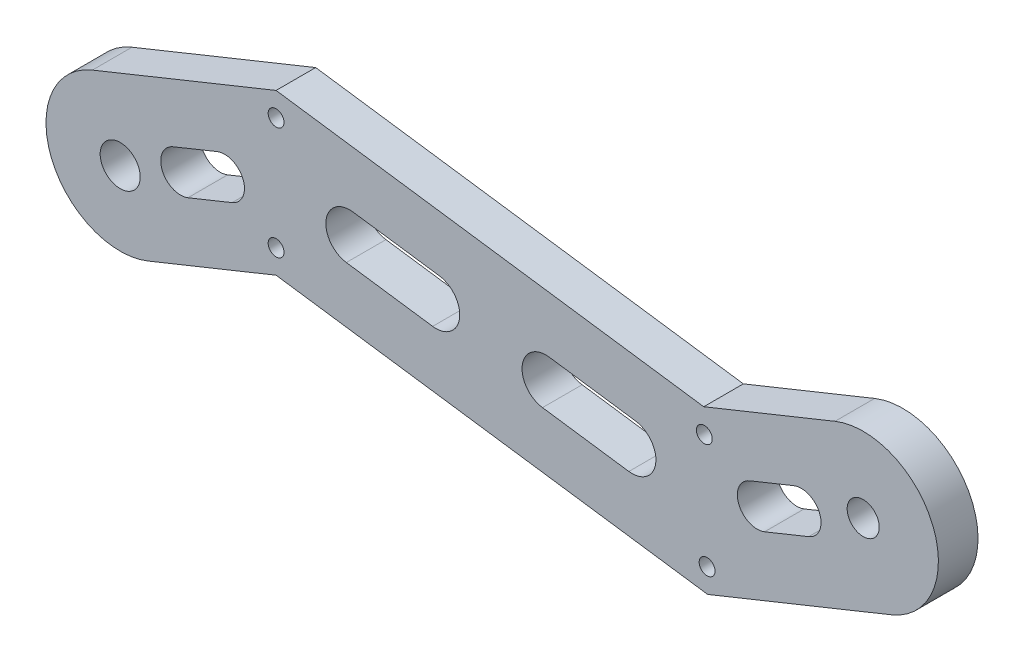
ISO-10303-21;
HEADER;
FILE_DESCRIPTION(('STEP AP214'),'2;1');
FILE_NAME('part.step','',(''),(''),'','','');
FILE_SCHEMA(('AUTOMOTIVE_DESIGN { 1 0 10303 214 1 1 1 1 }'));
ENDSEC;
DATA;
#1=APPLICATION_CONTEXT('core data for automotive mechanical design processes');
#2=APPLICATION_PROTOCOL_DEFINITION('international standard','automotive_design',2000,#1);
#3=PRODUCT_CONTEXT('',#1,'mechanical');
#4=PRODUCT('Part','Part','',(#3));
#5=PRODUCT_RELATED_PRODUCT_CATEGORY('part','',(#4));
#6=PRODUCT_DEFINITION_FORMATION('','',#4);
#7=PRODUCT_DEFINITION_CONTEXT('part definition',#1,'design');
#8=PRODUCT_DEFINITION('design','',#6,#7);
#9=PRODUCT_DEFINITION_SHAPE('','',#8);
#10=(LENGTH_UNIT() NAMED_UNIT(*) SI_UNIT(.MILLI.,.METRE.));
#11=(NAMED_UNIT(*) PLANE_ANGLE_UNIT() SI_UNIT($,.RADIAN.));
#12=(NAMED_UNIT(*) SI_UNIT($,.STERADIAN.) SOLID_ANGLE_UNIT());
#13=UNCERTAINTY_MEASURE_WITH_UNIT(LENGTH_MEASURE(1.E-05),#10,'distance_accuracy_value','');
#14=(GEOMETRIC_REPRESENTATION_CONTEXT(3) GLOBAL_UNCERTAINTY_ASSIGNED_CONTEXT((#13)) GLOBAL_UNIT_ASSIGNED_CONTEXT((#10,
#11,#12)) REPRESENTATION_CONTEXT('',''));
#15=CARTESIAN_POINT('',(0.,0.,0.));
#16=DIRECTION('',(0.,0.,1.));
#17=DIRECTION('',(1.,0.,0.));
#18=AXIS2_PLACEMENT_3D('',#15,#16,#17);
#19=CARTESIAN_POINT('',(-91.8699436205663,2.980916678925,10.));
#20=DIRECTION('',(0.,0.,1.));
#21=DIRECTION('',(1.,0.,0.));
#22=AXIS2_PLACEMENT_3D('',#19,#20,#21);
#23=PLANE('',#22);
#24=DIRECTION('',(0.927183854566787,0.374606593415913,0.));
#25=VECTOR('',#24,1.);
#26=CARTESIAN_POINT('',(70.7597122956534,4.2465525505887,10.));
#27=LINE('',#26,#25);
#28=CARTESIAN_POINT('',(70.7597122956534,4.2465525505887,10.));
#29=VERTEX_POINT('',#28);
#30=CARTESIAN_POINT('',(81.8859185504549,8.74183167157967,10.));
#31=VERTEX_POINT('',#30);
#32=EDGE_CURVE('E269',#29,#31,#27,.T.);
#33=ORIENTED_EDGE('',*,*,#32,.F.);
#34=CARTESIAN_POINT('',(68.8866793285738,8.88247182342264,10.));
#35=DIRECTION('',(0.,0.,1.));
#36=DIRECTION('',(1.,0.,0.));
#37=AXIS2_PLACEMENT_3D('',#34,#35,#36);
#38=CIRCLE('',#37,5.);
#39=CARTESIAN_POINT('',(67.0136463614943,13.5183910962566,10.));
#40=VERTEX_POINT('',#39);
#41=EDGE_CURVE('E267',#40,#29,#38,.T.);
#42=ORIENTED_EDGE('',*,*,#41,.F.);
#43=DIRECTION('',(-0.927183854566787,-0.374606593415913,0.));
#44=VECTOR('',#43,1.);
#45=CARTESIAN_POINT('',(67.0136463614943,13.5183910962566,10.));
#46=LINE('',#45,#44);
#47=CARTESIAN_POINT('',(78.1398526162957,18.0136702172475,10.));
#48=VERTEX_POINT('',#47);
#49=EDGE_CURVE('E275',#48,#40,#46,.T.);
#50=ORIENTED_EDGE('',*,*,#49,.F.);
#51=CARTESIAN_POINT('',(80.0128855833753,13.3777509444136,10.));
#52=DIRECTION('',(0.,0.,1.));
#53=DIRECTION('',(1.,0.,0.));
#54=AXIS2_PLACEMENT_3D('',#51,#52,#53);
#55=CIRCLE('',#54,5.);
#56=EDGE_CURVE('E272',#31,#48,#55,.T.);
#57=ORIENTED_EDGE('',*,*,#56,.F.);
#58=EDGE_LOOP('',(#33,#42,#50,#57));
#59=FACE_BOUND('',#58,.T.);
#60=DIRECTION('',(0.927183854566787,0.374606593415913,0.));
#61=VECTOR('',#60,1.);
#62=CARTESIAN_POINT('',(-74.7593499035873,4.50137156680685,10.));
#63=LINE('',#62,#61);
#64=CARTESIAN_POINT('',(-74.7593499035873,4.50137156680685,10.));
#65=VERTEX_POINT('',#64);
#66=CARTESIAN_POINT('',(-63.6331436487858,8.99665068779783,10.));
#67=VERTEX_POINT('',#66);
#68=EDGE_CURVE('E300',#65,#67,#63,.T.);
#69=ORIENTED_EDGE('',*,*,#68,.F.);
#70=CARTESIAN_POINT('',(-76.6323828706669,9.1372908396408,10.));
#71=DIRECTION('',(0.,0.,1.));
#72=DIRECTION('',(1.,0.,0.));
#73=AXIS2_PLACEMENT_3D('',#70,#71,#72);
#74=CIRCLE('',#73,5.);
#75=CARTESIAN_POINT('',(-78.5054158377464,13.7732101124747,10.));
#76=VERTEX_POINT('',#75);
#77=EDGE_CURVE('E298',#76,#65,#74,.T.);
#78=ORIENTED_EDGE('',*,*,#77,.F.);
#79=DIRECTION('',(-0.927183854566787,-0.374606593415913,0.));
#80=VECTOR('',#79,1.);
#81=CARTESIAN_POINT('',(-78.5054158377464,13.7732101124747,10.));
#82=LINE('',#81,#80);
#83=CARTESIAN_POINT('',(-67.379209582945,18.2684892334657,10.));
#84=VERTEX_POINT('',#83);
#85=EDGE_CURVE('E306',#84,#76,#82,.T.);
#86=ORIENTED_EDGE('',*,*,#85,.F.);
#87=CARTESIAN_POINT('',(-65.5061766158654,13.6325699606318,10.));
#88=DIRECTION('',(0.,0.,1.));
#89=DIRECTION('',(1.,0.,0.));
#90=AXIS2_PLACEMENT_3D('',#87,#88,#89);
#91=CIRCLE('',#90,5.);
#92=EDGE_CURVE('E303',#67,#84,#91,.T.);
#93=ORIENTED_EDGE('',*,*,#92,.F.);
#94=EDGE_LOOP('',(#69,#78,#86,#93));
#95=FACE_BOUND('',#94,.T.);
#96=CARTESIAN_POINT('',(-52.5256026519304,4.68051081808217,10.));
#97=DIRECTION('',(0.,0.,1.));
#98=DIRECTION('',(1.,0.,0.));
#99=AXIS2_PLACEMENT_3D('',#96,#97,#98);
#100=CIRCLE('',#99,2.);
#101=CARTESIAN_POINT('',(-50.5256026519304,4.68051081808217,10.));
#102=VERTEX_POINT('',#101);
#103=EDGE_CURVE('E329',#102,#102,#100,.T.);
#104=ORIENTED_EDGE('',*,*,#103,.F.);
#105=EDGE_LOOP('',(#104));
#106=FACE_BOUND('',#105,.T.);
#107=CARTESIAN_POINT('',(-52.5256026519304,33.0736137188269,10.));
#108=DIRECTION('',(0.,0.,1.));
#109=DIRECTION('',(1.,0.,0.));
#110=AXIS2_PLACEMENT_3D('',#107,#108,#109);
#111=CIRCLE('',#110,2.);
#112=CARTESIAN_POINT('',(-50.5256026519304,33.0736137188269,10.));
#113=VERTEX_POINT('',#112);
#114=EDGE_CURVE('E341',#113,#113,#111,.T.);
#115=ORIENTED_EDGE('',*,*,#114,.F.);
#116=EDGE_LOOP('',(#115));
#117=FACE_BOUND('',#116,.T.);
#118=CARTESIAN_POINT('',(-91.8699436205663,2.980916678925,10.));
#119=DIRECTION('',(0.,0.,1.));
#120=DIRECTION('',(1.,0.,0.));
#121=AXIS2_PLACEMENT_3D('',#118,#119,#120);
#122=CIRCLE('',#121,5.05);
#123=CARTESIAN_POINT('',(-86.8199436205663,2.980916678925,10.));
#124=VERTEX_POINT('',#123);
#125=EDGE_CURVE('E353',#124,#124,#122,.T.);
#126=ORIENTED_EDGE('',*,*,#125,.F.);
#127=EDGE_LOOP('',(#126));
#128=FACE_BOUND('',#127,.T.);
#129=DIRECTION('',(-0.927183854566787,-0.374606593415913,0.));
#130=VECTOR('',#129,1.);
#131=CARTESIAN_POINT('',(-52.5256026519304,39.0736137188269,10.));
#132=LINE('',#131,#130);
#133=CARTESIAN_POINT('',(-52.5256026519304,39.0736137188269,10.));
#134=VERTEX_POINT('',#133);
#135=CARTESIAN_POINT('',(-98.8847953802698,20.3432840480312,10.));
#136=VERTEX_POINT('',#135);
#137=EDGE_CURVE('E359',#134,#136,#132,.T.);
#138=ORIENTED_EDGE('',*,*,#137,.T.);
#139=CARTESIAN_POINT('',(-91.8699436205663,2.980916678925,10.));
#140=DIRECTION('',(0.,0.,1.));
#141=DIRECTION('',(1.,0.,0.));
#142=AXIS2_PLACEMENT_3D('',#139,#140,#141);
#143=CIRCLE('',#142,18.7259164227127);
#144=CARTESIAN_POINT('',(-84.8550918608627,-14.3814506901812,10.));
#145=VERTEX_POINT('',#144);
#146=EDGE_CURVE('E362',#136,#145,#143,.T.);
#147=ORIENTED_EDGE('',*,*,#146,.T.);
#148=DIRECTION('',(0.927183854566787,0.374606593415913,0.));
#149=VECTOR('',#148,1.);
#150=CARTESIAN_POINT('',(-52.5256026519304,-1.31948918191783,10.));
#151=LINE('',#150,#149);
#152=CARTESIAN_POINT('',(-52.5256026519304,-1.31948918191783,10.));
#153=VERTEX_POINT('',#152);
#154=EDGE_CURVE('E365',#145,#153,#151,.T.);
#155=ORIENTED_EDGE('',*,*,#154,.T.);
#156=DIRECTION('',(0.99026806874157,-0.139173100960066,0.));
#157=VECTOR('',#156,1.);
#158=CARTESIAN_POINT('',(-52.5256026519304,-1.31948918191783,10.));
#159=LINE('',#158,#157);
#160=CARTESIAN_POINT('',(56.4038849096423,-16.6285302875251,10.));
#161=VERTEX_POINT('',#160);
#162=EDGE_CURVE('E367',#153,#161,#159,.T.);
#163=ORIENTED_EDGE('',*,*,#162,.T.);
#164=DIRECTION('',(0.927183854566787,0.374606593415913,0.));
#165=VECTOR('',#164,1.);
#166=CARTESIAN_POINT('',(56.4038849096423,-16.6285302875251,10.));
#167=LINE('',#166,#165);
#168=CARTESIAN_POINT('',(102.763077637982,2.10179938327057,10.));
#169=VERTEX_POINT('',#168);
#170=EDGE_CURVE('E369',#161,#169,#167,.T.);
#171=ORIENTED_EDGE('',*,*,#170,.T.);
#172=CARTESIAN_POINT('',(95.6540738473726,19.6972012062936,10.));
#173=DIRECTION('',(0.,0.,1.));
#174=DIRECTION('',(-1.,0.,0.));
#175=AXIS2_PLACEMENT_3D('',#172,#173,#174);
#176=CIRCLE('',#175,18.9772521775028);
#177=CARTESIAN_POINT('',(88.5450700567636,37.2926030293166,10.));
#178=VERTEX_POINT('',#177);
#179=EDGE_CURVE('E371',#169,#178,#176,.T.);
#180=ORIENTED_EDGE('',*,*,#179,.T.);
#181=DIRECTION('',(-0.927183854566787,-0.374606593415913,0.));
#182=VECTOR('',#181,1.);
#183=CARTESIAN_POINT('',(55.4083258196354,23.9044893187248,10.));
#184=LINE('',#183,#182);
#185=CARTESIAN_POINT('',(55.4083258196354,23.9044893187248,10.));
#186=VERTEX_POINT('',#185);
#187=EDGE_CURVE('E373',#178,#186,#184,.T.);
#188=ORIENTED_EDGE('',*,*,#187,.T.);
#189=DIRECTION('',(-0.99026806874157,0.139173100960066,0.));
#190=VECTOR('',#189,1.);
#191=CARTESIAN_POINT('',(-52.5256026519304,39.0736137188269,10.));
#192=LINE('',#191,#190);
#193=EDGE_CURVE('E375',#186,#134,#192,.T.);
#194=ORIENTED_EDGE('',*,*,#193,.T.);
#195=EDGE_LOOP('',(#138,#147,#155,#163,#171,#180,#188,#194));
#196=FACE_BOUND('',#195,.T.);
#197=CARTESIAN_POINT('',(95.6540738473726,19.6972012062936,10.));
#198=DIRECTION('',(0.,0.,1.));
#199=DIRECTION('',(1.,0.,0.));
#200=AXIS2_PLACEMENT_3D('',#197,#198,#199);
#201=CIRCLE('',#200,4.05);
#202=CARTESIAN_POINT('',(99.7040738473727,19.6972012062936,10.));
#203=VERTEX_POINT('',#202);
#204=EDGE_CURVE('E347',#203,#203,#201,.T.);
#205=ORIENTED_EDGE('',*,*,#204,.F.);
#206=EDGE_LOOP('',(#205));
#207=FACE_BOUND('',#206,.T.);
#208=CARTESIAN_POINT('',(55.555695904521,17.9044893187248,10.));
#209=DIRECTION('',(0.,0.,1.));
#210=DIRECTION('',(1.,0.,0.));
#211=AXIS2_PLACEMENT_3D('',#208,#209,#210);
#212=CIRCLE('',#211,2.);
#213=CARTESIAN_POINT('',(57.555695904521,17.9044893187248,10.));
#214=VERTEX_POINT('',#213);
#215=EDGE_CURVE('E335',#214,#214,#212,.T.);
#216=ORIENTED_EDGE('',*,*,#215,.F.);
#217=EDGE_LOOP('',(#216));
#218=FACE_BOUND('',#217,.T.);
#219=CARTESIAN_POINT('',(56.2565148247568,-10.6285302875251,10.));
#220=DIRECTION('',(0.,0.,1.));
#221=DIRECTION('',(1.,0.,0.));
#222=AXIS2_PLACEMENT_3D('',#219,#220,#221);
#223=CIRCLE('',#222,2.);
#224=CARTESIAN_POINT('',(58.2565148247568,-10.6285302875251,10.));
#225=VERTEX_POINT('',#224);
#226=EDGE_CURVE('E261',#225,#225,#223,.T.);
#227=ORIENTED_EDGE('',*,*,#226,.F.);
#228=EDGE_LOOP('',(#227));
#229=FACE_BOUND('',#228,.T.);
#230=DIRECTION('',(0.99026806874157,-0.139173100960066,0.));
#231=VECTOR('',#230,1.);
#232=CARTESIAN_POINT('',(-34.7944377241027,10.3261441141401,10.));
#233=LINE('',#232,#231);
#234=CARTESIAN_POINT('',(-34.7944377241027,10.3261441141401,10.));
#235=VERTEX_POINT('',#234);
#236=CARTESIAN_POINT('',(-13.0085402117882,7.2643358930187,10.));
#237=VERTEX_POINT('',#236);
#238=EDGE_CURVE('E232',#235,#237,#233,.T.);
#239=ORIENTED_EDGE('',*,*,#238,.F.);
#240=CARTESIAN_POINT('',(-33.9593991183423,16.2677525265896,10.));
#241=DIRECTION('',(0.,0.,1.));
#242=DIRECTION('',(1.,0.,0.));
#243=AXIS2_PLACEMENT_3D('',#240,#241,#242);
#244=CIRCLE('',#243,6.);
#245=CARTESIAN_POINT('',(-33.1243605125819,22.209360939039,10.));
#246=VERTEX_POINT('',#245);
#247=EDGE_CURVE('E230',#246,#235,#244,.T.);
#248=ORIENTED_EDGE('',*,*,#247,.F.);
#249=DIRECTION('',(-0.99026806874157,0.139173100960065,0.));
#250=VECTOR('',#249,1.);
#251=CARTESIAN_POINT('',(-33.1243605125819,22.209360939039,10.));
#252=LINE('',#251,#250);
#253=CARTESIAN_POINT('',(-11.3384630002674,19.1475527179175,10.));
#254=VERTEX_POINT('',#253);
#255=EDGE_CURVE('E238',#254,#246,#252,.T.);
#256=ORIENTED_EDGE('',*,*,#255,.F.);
#257=CARTESIAN_POINT('',(-12.1735016060278,13.2059443054681,10.));
#258=DIRECTION('',(0.,0.,1.));
#259=DIRECTION('',(1.,0.,0.));
#260=AXIS2_PLACEMENT_3D('',#257,#258,#259);
#261=CIRCLE('',#260,6.);
#262=EDGE_CURVE('E235',#237,#254,#261,.T.);
#263=ORIENTED_EDGE('',*,*,#262,.F.);
#264=EDGE_LOOP('',(#239,#248,#256,#263));
#265=FACE_BOUND('',#264,.T.);
#266=DIRECTION('',(0.99026806874157,-0.139173100960066,0.));
#267=VECTOR('',#266,1.);
#268=CARTESIAN_POINT('',(14.7189657129758,3.36748906613686,10.));
#269=LINE('',#268,#267);
#270=CARTESIAN_POINT('',(14.7189657129758,3.36748906613686,10.));
#271=VERTEX_POINT('',#270);
#272=CARTESIAN_POINT('',(36.5048632252904,0.305680845015419,10.));
#273=VERTEX_POINT('',#272);
#274=EDGE_CURVE('E202',#271,#273,#269,.T.);
#275=ORIENTED_EDGE('',*,*,#274,.F.);
#276=CARTESIAN_POINT('',(15.5540043187362,9.30909747858628,10.));
#277=DIRECTION('',(0.,0.,1.));
#278=DIRECTION('',(1.,0.,0.));
#279=AXIS2_PLACEMENT_3D('',#276,#277,#278);
#280=CIRCLE('',#279,6.);
#281=CARTESIAN_POINT('',(16.3890429244966,15.2507058910357,10.));
#282=VERTEX_POINT('',#281);
#283=EDGE_CURVE('E194',#282,#271,#280,.T.);
#284=ORIENTED_EDGE('',*,*,#283,.F.);
#285=DIRECTION('',(-0.99026806874157,0.139173100960066,0.));
#286=VECTOR('',#285,1.);
#287=CARTESIAN_POINT('',(16.3890429244966,15.2507058910357,10.));
#288=LINE('',#287,#286);
#289=CARTESIAN_POINT('',(38.1749404368111,12.1888976699143,10.));
#290=VERTEX_POINT('',#289);
#291=EDGE_CURVE('E216',#290,#282,#288,.T.);
#292=ORIENTED_EDGE('',*,*,#291,.F.);
#293=CARTESIAN_POINT('',(37.3399018310508,6.24728925746484,10.));
#294=DIRECTION('',(0.,0.,1.));
#295=DIRECTION('',(1.,0.,0.));
#296=AXIS2_PLACEMENT_3D('',#293,#294,#295);
#297=CIRCLE('',#296,6.);
#298=EDGE_CURVE('E214',#273,#290,#297,.T.);
#299=ORIENTED_EDGE('',*,*,#298,.F.);
#300=EDGE_LOOP('',(#275,#284,#292,#299));
#301=FACE_BOUND('',#300,.T.);
#302=ADVANCED_FACE('F33',(#59,#95,#106,#117,#128,#196,#207,#218,#229,#265,#301),#23,.T.);
#303=CARTESIAN_POINT('',(-91.8699436205663,2.980916678925,0.));
#304=DIRECTION('',(0.,0.,1.));
#305=DIRECTION('',(1.,0.,0.));
#306=AXIS2_PLACEMENT_3D('',#303,#304,#305);
#307=PLANE('',#306);
#308=CARTESIAN_POINT('',(-33.9593991183423,16.2677525265896,0.));
#309=DIRECTION('',(0.,0.,1.));
#310=DIRECTION('',(1.,0.,0.));
#311=AXIS2_PLACEMENT_3D('',#308,#309,#310);
#312=CIRCLE('',#311,6.);
#313=CARTESIAN_POINT('',(-33.1243605125819,22.209360939039,0.));
#314=VERTEX_POINT('',#313);
#315=CARTESIAN_POINT('',(-34.7944377241027,10.3261441141401,0.));
#316=VERTEX_POINT('',#315);
#317=EDGE_CURVE('E210',#314,#316,#312,.T.);
#318=ORIENTED_EDGE('',*,*,#317,.T.);
#319=DIRECTION('',(0.99026806874157,-0.139173100960066,0.));
#320=VECTOR('',#319,1.);
#321=CARTESIAN_POINT('',(-34.7944377241027,10.3261441141401,0.));
#322=LINE('',#321,#320);
#323=CARTESIAN_POINT('',(-13.0085402117882,7.2643358930187,0.));
#324=VERTEX_POINT('',#323);
#325=EDGE_CURVE('E243',#316,#324,#322,.T.);
#326=ORIENTED_EDGE('',*,*,#325,.T.);
#327=CARTESIAN_POINT('',(-12.1735016060278,13.2059443054681,0.));
#328=DIRECTION('',(0.,0.,1.));
#329=DIRECTION('',(1.,0.,0.));
#330=AXIS2_PLACEMENT_3D('',#327,#328,#329);
#331=CIRCLE('',#330,6.);
#332=CARTESIAN_POINT('',(-11.3384630002674,19.1475527179175,0.));
#333=VERTEX_POINT('',#332);
#334=EDGE_CURVE('E246',#324,#333,#331,.T.);
#335=ORIENTED_EDGE('',*,*,#334,.T.);
#336=DIRECTION('',(-0.99026806874157,0.139173100960065,0.));
#337=VECTOR('',#336,1.);
#338=CARTESIAN_POINT('',(-33.1243605125819,22.209360939039,0.));
#339=LINE('',#338,#337);
#340=EDGE_CURVE('E233',#333,#314,#339,.T.);
#341=ORIENTED_EDGE('',*,*,#340,.T.);
#342=EDGE_LOOP('',(#318,#326,#335,#341));
#343=FACE_BOUND('',#342,.T.);
#344=CARTESIAN_POINT('',(-76.6323828706669,9.1372908396408,0.));
#345=DIRECTION('',(0.,0.,1.));
#346=DIRECTION('',(1.,0.,0.));
#347=AXIS2_PLACEMENT_3D('',#344,#345,#346);
#348=CIRCLE('',#347,5.);
#349=CARTESIAN_POINT('',(-78.5054158377464,13.7732101124747,0.));
#350=VERTEX_POINT('',#349);
#351=CARTESIAN_POINT('',(-74.7593499035873,4.50137156680685,0.));
#352=VERTEX_POINT('',#351);
#353=EDGE_CURVE('E297',#350,#352,#348,.T.);
#354=ORIENTED_EDGE('',*,*,#353,.T.);
#355=DIRECTION('',(0.927183854566787,0.374606593415913,0.));
#356=VECTOR('',#355,1.);
#357=CARTESIAN_POINT('',(-74.7593499035873,4.50137156680685,0.));
#358=LINE('',#357,#356);
#359=CARTESIAN_POINT('',(-63.6331436487858,8.99665068779783,0.));
#360=VERTEX_POINT('',#359);
#361=EDGE_CURVE('E311',#352,#360,#358,.T.);
#362=ORIENTED_EDGE('',*,*,#361,.T.);
#363=CARTESIAN_POINT('',(-65.5061766158654,13.6325699606318,0.));
#364=DIRECTION('',(0.,0.,1.));
#365=DIRECTION('',(1.,0.,0.));
#366=AXIS2_PLACEMENT_3D('',#363,#364,#365);
#367=CIRCLE('',#366,5.);
#368=CARTESIAN_POINT('',(-67.379209582945,18.2684892334657,0.));
#369=VERTEX_POINT('',#368);
#370=EDGE_CURVE('E314',#360,#369,#367,.T.);
#371=ORIENTED_EDGE('',*,*,#370,.T.);
#372=DIRECTION('',(-0.927183854566787,-0.374606593415913,0.));
#373=VECTOR('',#372,1.);
#374=CARTESIAN_POINT('',(-78.5054158377464,13.7732101124747,0.));
#375=LINE('',#374,#373);
#376=EDGE_CURVE('E301',#369,#350,#375,.T.);
#377=ORIENTED_EDGE('',*,*,#376,.T.);
#378=EDGE_LOOP('',(#354,#362,#371,#377));
#379=FACE_BOUND('',#378,.T.);
#380=DIRECTION('',(-0.927183854566787,-0.374606593415913,0.));
#381=VECTOR('',#380,1.);
#382=CARTESIAN_POINT('',(-52.5256026519304,39.0736137188269,0.));
#383=LINE('',#382,#381);
#384=CARTESIAN_POINT('',(-52.5256026519304,39.0736137188269,0.));
#385=VERTEX_POINT('',#384);
#386=CARTESIAN_POINT('',(-98.8847953802698,20.3432840480312,0.));
#387=VERTEX_POINT('',#386);
#388=EDGE_CURVE('E356',#385,#387,#383,.T.);
#389=ORIENTED_EDGE('',*,*,#388,.F.);
#390=DIRECTION('',(-0.99026806874157,0.139173100960066,0.));
#391=VECTOR('',#390,1.);
#392=CARTESIAN_POINT('',(-52.5256026519304,39.0736137188269,0.));
#393=LINE('',#392,#391);
#394=CARTESIAN_POINT('',(55.4083258196354,23.9044893187248,0.));
#395=VERTEX_POINT('',#394);
#396=EDGE_CURVE('E363',#395,#385,#393,.T.);
#397=ORIENTED_EDGE('',*,*,#396,.F.);
#398=DIRECTION('',(-0.927183854566787,-0.374606593415913,0.));
#399=VECTOR('',#398,1.);
#400=CARTESIAN_POINT('',(55.4083258196354,23.9044893187248,0.));
#401=LINE('',#400,#399);
#402=CARTESIAN_POINT('',(88.5450700567636,37.2926030293166,0.));
#403=VERTEX_POINT('',#402);
#404=EDGE_CURVE('E390',#403,#395,#401,.T.);
#405=ORIENTED_EDGE('',*,*,#404,.F.);
#406=CARTESIAN_POINT('',(95.6540738473726,19.6972012062936,0.));
#407=DIRECTION('',(0.,0.,1.));
#408=DIRECTION('',(-1.,0.,0.));
#409=AXIS2_PLACEMENT_3D('',#406,#407,#408);
#410=CIRCLE('',#409,18.9772521775028);
#411=CARTESIAN_POINT('',(102.763077637982,2.10179938327057,0.));
#412=VERTEX_POINT('',#411);
#413=EDGE_CURVE('E388',#412,#403,#410,.T.);
#414=ORIENTED_EDGE('',*,*,#413,.F.);
#415=DIRECTION('',(0.927183854566787,0.374606593415913,0.));
#416=VECTOR('',#415,1.);
#417=CARTESIAN_POINT('',(56.4038849096423,-16.6285302875251,0.));
#418=LINE('',#417,#416);
#419=CARTESIAN_POINT('',(56.4038849096423,-16.6285302875251,0.));
#420=VERTEX_POINT('',#419);
#421=EDGE_CURVE('E386',#420,#412,#418,.T.);
#422=ORIENTED_EDGE('',*,*,#421,.F.);
#423=DIRECTION('',(0.99026806874157,-0.139173100960066,0.));
#424=VECTOR('',#423,1.);
#425=CARTESIAN_POINT('',(-52.5256026519304,-1.31948918191783,0.));
#426=LINE('',#425,#424);
#427=CARTESIAN_POINT('',(-52.5256026519304,-1.31948918191783,0.));
#428=VERTEX_POINT('',#427);
#429=EDGE_CURVE('E384',#428,#420,#426,.T.);
#430=ORIENTED_EDGE('',*,*,#429,.F.);
#431=DIRECTION('',(0.927183854566787,0.374606593415913,0.));
#432=VECTOR('',#431,1.);
#433=CARTESIAN_POINT('',(-52.5256026519304,-1.31948918191783,0.));
#434=LINE('',#433,#432);
#435=CARTESIAN_POINT('',(-84.8550918608627,-14.3814506901812,0.));
#436=VERTEX_POINT('',#435);
#437=EDGE_CURVE('E382',#436,#428,#434,.T.);
#438=ORIENTED_EDGE('',*,*,#437,.F.);
#439=CARTESIAN_POINT('',(-91.8699436205663,2.980916678925,0.));
#440=DIRECTION('',(0.,0.,1.));
#441=DIRECTION('',(1.,0.,0.));
#442=AXIS2_PLACEMENT_3D('',#439,#440,#441);
#443=CIRCLE('',#442,18.7259164227127);
#444=EDGE_CURVE('E380',#387,#436,#443,.T.);
#445=ORIENTED_EDGE('',*,*,#444,.F.);
#446=EDGE_LOOP('',(#389,#397,#405,#414,#422,#430,#438,#445));
#447=FACE_BOUND('',#446,.T.);
#448=CARTESIAN_POINT('',(-91.8699436205663,2.980916678925,0.));
#449=DIRECTION('',(0.,0.,1.));
#450=DIRECTION('',(1.,0.,0.));
#451=AXIS2_PLACEMENT_3D('',#448,#449,#450);
#452=CIRCLE('',#451,5.05);
#453=CARTESIAN_POINT('',(-86.8199436205663,2.980916678925,0.));
#454=VERTEX_POINT('',#453);
#455=EDGE_CURVE('E350',#454,#454,#452,.T.);
#456=ORIENTED_EDGE('',*,*,#455,.T.);
#457=EDGE_LOOP('',(#456));
#458=FACE_BOUND('',#457,.T.);
#459=CARTESIAN_POINT('',(95.6540738473726,19.6972012062936,0.));
#460=DIRECTION('',(0.,0.,1.));
#461=DIRECTION('',(1.,0.,0.));
#462=AXIS2_PLACEMENT_3D('',#459,#460,#461);
#463=CIRCLE('',#462,4.05);
#464=CARTESIAN_POINT('',(99.7040738473727,19.6972012062936,0.));
#465=VERTEX_POINT('',#464);
#466=EDGE_CURVE('E344',#465,#465,#463,.T.);
#467=ORIENTED_EDGE('',*,*,#466,.T.);
#468=EDGE_LOOP('',(#467));
#469=FACE_BOUND('',#468,.T.);
#470=CARTESIAN_POINT('',(-52.5256026519304,33.0736137188269,0.));
#471=DIRECTION('',(0.,0.,1.));
#472=DIRECTION('',(1.,0.,0.));
#473=AXIS2_PLACEMENT_3D('',#470,#471,#472);
#474=CIRCLE('',#473,2.);
#475=CARTESIAN_POINT('',(-50.5256026519304,33.0736137188269,0.));
#476=VERTEX_POINT('',#475);
#477=EDGE_CURVE('E338',#476,#476,#474,.T.);
#478=ORIENTED_EDGE('',*,*,#477,.T.);
#479=EDGE_LOOP('',(#478));
#480=FACE_BOUND('',#479,.T.);
#481=CARTESIAN_POINT('',(55.555695904521,17.9044893187248,0.));
#482=DIRECTION('',(0.,0.,1.));
#483=DIRECTION('',(1.,0.,0.));
#484=AXIS2_PLACEMENT_3D('',#481,#482,#483);
#485=CIRCLE('',#484,2.);
#486=CARTESIAN_POINT('',(57.555695904521,17.9044893187248,0.));
#487=VERTEX_POINT('',#486);
#488=EDGE_CURVE('E332',#487,#487,#485,.T.);
#489=ORIENTED_EDGE('',*,*,#488,.T.);
#490=EDGE_LOOP('',(#489));
#491=FACE_BOUND('',#490,.T.);
#492=CARTESIAN_POINT('',(-52.5256026519304,4.68051081808217,0.));
#493=DIRECTION('',(0.,0.,1.));
#494=DIRECTION('',(1.,0.,0.));
#495=AXIS2_PLACEMENT_3D('',#492,#493,#494);
#496=CIRCLE('',#495,2.);
#497=CARTESIAN_POINT('',(-50.5256026519304,4.68051081808217,0.));
#498=VERTEX_POINT('',#497);
#499=EDGE_CURVE('E328',#498,#498,#496,.T.);
#500=ORIENTED_EDGE('',*,*,#499,.T.);
#501=EDGE_LOOP('',(#500));
#502=FACE_BOUND('',#501,.T.);
#503=CARTESIAN_POINT('',(68.8866793285738,8.88247182342264,0.));
#504=DIRECTION('',(0.,0.,1.));
#505=DIRECTION('',(1.,0.,0.));
#506=AXIS2_PLACEMENT_3D('',#503,#504,#505);
#507=CIRCLE('',#506,5.);
#508=CARTESIAN_POINT('',(67.0136463614943,13.5183910962566,0.));
#509=VERTEX_POINT('',#508);
#510=CARTESIAN_POINT('',(70.7597122956534,4.2465525505887,0.));
#511=VERTEX_POINT('',#510);
#512=EDGE_CURVE('E264',#509,#511,#507,.T.);
#513=ORIENTED_EDGE('',*,*,#512,.T.);
#514=DIRECTION('',(0.927183854566787,0.374606593415913,0.));
#515=VECTOR('',#514,1.);
#516=CARTESIAN_POINT('',(70.7597122956534,4.2465525505887,0.));
#517=LINE('',#516,#515);
#518=CARTESIAN_POINT('',(81.8859185504549,8.74183167157967,0.));
#519=VERTEX_POINT('',#518);
#520=EDGE_CURVE('E280',#511,#519,#517,.T.);
#521=ORIENTED_EDGE('',*,*,#520,.T.);
#522=CARTESIAN_POINT('',(80.0128855833753,13.3777509444136,0.));
#523=DIRECTION('',(0.,0.,1.));
#524=DIRECTION('',(1.,0.,0.));
#525=AXIS2_PLACEMENT_3D('',#522,#523,#524);
#526=CIRCLE('',#525,5.);
#527=CARTESIAN_POINT('',(78.1398526162958,18.0136702172475,0.));
#528=VERTEX_POINT('',#527);
#529=EDGE_CURVE('E283',#519,#528,#526,.T.);
#530=ORIENTED_EDGE('',*,*,#529,.T.);
#531=DIRECTION('',(-0.927183854566787,-0.374606593415913,0.));
#532=VECTOR('',#531,1.);
#533=CARTESIAN_POINT('',(67.0136463614943,13.5183910962566,0.));
#534=LINE('',#533,#532);
#535=EDGE_CURVE('E270',#528,#509,#534,.T.);
#536=ORIENTED_EDGE('',*,*,#535,.T.);
#537=EDGE_LOOP('',(#513,#521,#530,#536));
#538=FACE_BOUND('',#537,.T.);
#539=CARTESIAN_POINT('',(56.2565148247568,-10.6285302875251,0.));
#540=DIRECTION('',(0.,0.,1.));
#541=DIRECTION('',(1.,0.,0.));
#542=AXIS2_PLACEMENT_3D('',#539,#540,#541);
#543=CIRCLE('',#542,2.);
#544=CARTESIAN_POINT('',(58.2565148247568,-10.6285302875251,0.));
#545=VERTEX_POINT('',#544);
#546=EDGE_CURVE('E260',#545,#545,#543,.T.);
#547=ORIENTED_EDGE('',*,*,#546,.T.);
#548=EDGE_LOOP('',(#547));
#549=FACE_BOUND('',#548,.T.);
#550=CARTESIAN_POINT('',(15.5540043187362,9.30909747858628,0.));
#551=DIRECTION('',(0.,0.,1.));
#552=DIRECTION('',(1.,0.,0.));
#553=AXIS2_PLACEMENT_3D('',#550,#551,#552);
#554=CIRCLE('',#553,6.);
#555=CARTESIAN_POINT('',(16.3890429244966,15.2507058910357,0.));
#556=VERTEX_POINT('',#555);
#557=CARTESIAN_POINT('',(14.7189657129758,3.36748906613686,0.));
#558=VERTEX_POINT('',#557);
#559=EDGE_CURVE('E56',#556,#558,#554,.T.);
#560=ORIENTED_EDGE('',*,*,#559,.T.);
#561=DIRECTION('',(0.99026806874157,-0.139173100960066,0.));
#562=VECTOR('',#561,1.);
#563=CARTESIAN_POINT('',(14.7189657129758,3.36748906613686,0.));
#564=LINE('',#563,#562);
#565=CARTESIAN_POINT('',(36.5048632252904,0.305680845015419,0.));
#566=VERTEX_POINT('',#565);
#567=EDGE_CURVE('E209',#558,#566,#564,.T.);
#568=ORIENTED_EDGE('',*,*,#567,.T.);
#569=CARTESIAN_POINT('',(37.3399018310508,6.24728925746484,0.));
#570=DIRECTION('',(0.,0.,1.));
#571=DIRECTION('',(1.,0.,0.));
#572=AXIS2_PLACEMENT_3D('',#569,#570,#571);
#573=CIRCLE('',#572,6.);
#574=CARTESIAN_POINT('',(38.1749404368111,12.1888976699143,0.));
#575=VERTEX_POINT('',#574);
#576=EDGE_CURVE('E222',#566,#575,#573,.T.);
#577=ORIENTED_EDGE('',*,*,#576,.T.);
#578=DIRECTION('',(-0.99026806874157,0.139173100960066,0.));
#579=VECTOR('',#578,1.);
#580=CARTESIAN_POINT('',(16.3890429244966,15.2507058910357,0.));
#581=LINE('',#580,#579);
#582=EDGE_CURVE('E203',#575,#556,#581,.T.);
#583=ORIENTED_EDGE('',*,*,#582,.T.);
#584=EDGE_LOOP('',(#560,#568,#577,#583));
#585=FACE_BOUND('',#584,.T.);
#586=ADVANCED_FACE('F420',(#343,#379,#447,#458,#469,#480,#491,#502,#538,#549,#585),#307,.F.);
#587=CARTESIAN_POINT('',(-52.5256026519304,39.0736137188269,10.));
#588=DIRECTION('',(0.374606593415913,-0.927183854566787,0.));
#589=DIRECTION('',(0.927183854566787,0.374606593415913,0.));
#590=AXIS2_PLACEMENT_3D('',#587,#588,#589);
#591=PLANE('',#590);
#592=ORIENTED_EDGE('',*,*,#388,.T.);
#593=DIRECTION('',(0.,0.,-1.));
#594=VECTOR('',#593,1.);
#595=CARTESIAN_POINT('',(-98.8847953802698,20.3432840480312,10.));
#596=LINE('',#595,#594);
#597=EDGE_CURVE('E11',#136,#387,#596,.T.);
#598=ORIENTED_EDGE('',*,*,#597,.F.);
#599=ORIENTED_EDGE('',*,*,#137,.F.);
#600=DIRECTION('',(0.,0.,-1.));
#601=VECTOR('',#600,1.);
#602=CARTESIAN_POINT('',(-52.5256026519304,39.0736137188269,10.));
#603=LINE('',#602,#601);
#604=EDGE_CURVE('E377',#134,#385,#603,.T.);
#605=ORIENTED_EDGE('',*,*,#604,.T.);
#606=EDGE_LOOP('',(#592,#598,#599,#605));
#607=FACE_BOUND('',#606,.T.);
#608=ADVANCED_FACE('F35',(#607),#591,.F.);
#609=CARTESIAN_POINT('',(-91.8699436205663,2.980916678925,10.));
#610=DIRECTION('',(0.,0.,-1.));
#611=DIRECTION('',(-1.,0.,0.));
#612=AXIS2_PLACEMENT_3D('',#609,#610,#611);
#613=CYLINDRICAL_SURFACE('',#612,18.7259164227127);
#614=ORIENTED_EDGE('',*,*,#444,.T.);
#615=DIRECTION('',(0.,0.,-1.));
#616=VECTOR('',#615,1.);
#617=CARTESIAN_POINT('',(-84.8550918608627,-14.3814506901812,10.));
#618=LINE('',#617,#616);
#619=EDGE_CURVE('E41',#145,#436,#618,.T.);
#620=ORIENTED_EDGE('',*,*,#619,.F.);
#621=ORIENTED_EDGE('',*,*,#146,.F.);
#622=ORIENTED_EDGE('',*,*,#597,.T.);
#623=EDGE_LOOP('',(#614,#620,#621,#622));
#624=FACE_BOUND('',#623,.T.);
#625=ADVANCED_FACE('F438',(#624),#613,.T.);
#626=CARTESIAN_POINT('',(-52.5256026519304,-1.31948918191783,10.));
#627=DIRECTION('',(-0.374606593415913,0.927183854566787,0.));
#628=DIRECTION('',(-0.927183854566787,-0.374606593415913,0.));
#629=AXIS2_PLACEMENT_3D('',#626,#627,#628);
#630=PLANE('',#629);
#631=ORIENTED_EDGE('',*,*,#437,.T.);
#632=DIRECTION('',(0.,0.,-1.));
#633=VECTOR('',#632,1.);
#634=CARTESIAN_POINT('',(-52.5256026519304,-1.31948918191783,10.));
#635=LINE('',#634,#633);
#636=EDGE_CURVE('E407',#153,#428,#635,.T.);
#637=ORIENTED_EDGE('',*,*,#636,.F.);
#638=ORIENTED_EDGE('',*,*,#154,.F.);
#639=ORIENTED_EDGE('',*,*,#619,.T.);
#640=EDGE_LOOP('',(#631,#637,#638,#639));
#641=FACE_BOUND('',#640,.T.);
#642=ADVANCED_FACE('F414',(#641),#630,.F.);
#643=CARTESIAN_POINT('',(-52.5256026519304,-1.31948918191783,10.));
#644=DIRECTION('',(0.139173100960066,0.99026806874157,0.));
#645=DIRECTION('',(-0.99026806874157,0.139173100960066,0.));
#646=AXIS2_PLACEMENT_3D('',#643,#644,#645);
#647=PLANE('',#646);
#648=ORIENTED_EDGE('',*,*,#429,.T.);
#649=DIRECTION('',(0.,0.,-1.));
#650=VECTOR('',#649,1.);
#651=CARTESIAN_POINT('',(56.4038849096423,-16.6285302875251,10.));
#652=LINE('',#651,#650);
#653=EDGE_CURVE('E404',#161,#420,#652,.T.);
#654=ORIENTED_EDGE('',*,*,#653,.F.);
#655=ORIENTED_EDGE('',*,*,#162,.F.);
#656=ORIENTED_EDGE('',*,*,#636,.T.);
#657=EDGE_LOOP('',(#648,#654,#655,#656));
#658=FACE_BOUND('',#657,.T.);
#659=ADVANCED_FACE('F426',(#658),#647,.F.);
#660=CARTESIAN_POINT('',(56.4038849096423,-16.6285302875251,10.));
#661=DIRECTION('',(-0.374606593415913,0.927183854566787,0.));
#662=DIRECTION('',(-0.927183854566787,-0.374606593415913,0.));
#663=AXIS2_PLACEMENT_3D('',#660,#661,#662);
#664=PLANE('',#663);
#665=ORIENTED_EDGE('',*,*,#421,.T.);
#666=DIRECTION('',(0.,0.,-1.));
#667=VECTOR('',#666,1.);
#668=CARTESIAN_POINT('',(102.763077637982,2.10179938327057,10.));
#669=LINE('',#668,#667);
#670=EDGE_CURVE('E401',#169,#412,#669,.T.);
#671=ORIENTED_EDGE('',*,*,#670,.F.);
#672=ORIENTED_EDGE('',*,*,#170,.F.);
#673=ORIENTED_EDGE('',*,*,#653,.T.);
#674=EDGE_LOOP('',(#665,#671,#672,#673));
#675=FACE_BOUND('',#674,.T.);
#676=ADVANCED_FACE('F430',(#675),#664,.F.);
#677=CARTESIAN_POINT('',(95.6540738473726,19.6972012062936,10.));
#678=DIRECTION('',(0.,0.,-1.));
#679=DIRECTION('',(-1.,0.,0.));
#680=AXIS2_PLACEMENT_3D('',#677,#678,#679);
#681=CYLINDRICAL_SURFACE('',#680,18.9772521775028);
#682=ORIENTED_EDGE('',*,*,#413,.T.);
#683=DIRECTION('',(0.,0.,-1.));
#684=VECTOR('',#683,1.);
#685=CARTESIAN_POINT('',(88.5450700567636,37.2926030293166,10.));
#686=LINE('',#685,#684);
#687=EDGE_CURVE('E398',#178,#403,#686,.T.);
#688=ORIENTED_EDGE('',*,*,#687,.F.);
#689=ORIENTED_EDGE('',*,*,#179,.F.);
#690=ORIENTED_EDGE('',*,*,#670,.T.);
#691=EDGE_LOOP('',(#682,#688,#689,#690));
#692=FACE_BOUND('',#691,.T.);
#693=ADVANCED_FACE('F451',(#692),#681,.T.);
#694=CARTESIAN_POINT('',(55.4083258196354,23.9044893187248,10.));
#695=DIRECTION('',(0.374606593415913,-0.927183854566787,0.));
#696=DIRECTION('',(0.927183854566787,0.374606593415913,0.));
#697=AXIS2_PLACEMENT_3D('',#694,#695,#696);
#698=PLANE('',#697);
#699=ORIENTED_EDGE('',*,*,#404,.T.);
#700=DIRECTION('',(0.,0.,-1.));
#701=VECTOR('',#700,1.);
#702=CARTESIAN_POINT('',(55.4083258196354,23.9044893187248,10.));
#703=LINE('',#702,#701);
#704=EDGE_CURVE('E395',#186,#395,#703,.T.);
#705=ORIENTED_EDGE('',*,*,#704,.F.);
#706=ORIENTED_EDGE('',*,*,#187,.F.);
#707=ORIENTED_EDGE('',*,*,#687,.T.);
#708=EDGE_LOOP('',(#699,#705,#706,#707));
#709=FACE_BOUND('',#708,.T.);
#710=ADVANCED_FACE('F449',(#709),#698,.F.);
#711=CARTESIAN_POINT('',(-52.5256026519304,39.0736137188269,10.));
#712=DIRECTION('',(-0.139173100960066,-0.99026806874157,0.));
#713=DIRECTION('',(0.99026806874157,-0.139173100960066,0.));
#714=AXIS2_PLACEMENT_3D('',#711,#712,#713);
#715=PLANE('',#714);
#716=ORIENTED_EDGE('',*,*,#396,.T.);
#717=ORIENTED_EDGE('',*,*,#604,.F.);
#718=ORIENTED_EDGE('',*,*,#193,.F.);
#719=ORIENTED_EDGE('',*,*,#704,.T.);
#720=EDGE_LOOP('',(#716,#717,#718,#719));
#721=FACE_BOUND('',#720,.T.);
#722=ADVANCED_FACE('F444',(#721),#715,.F.);
#723=CARTESIAN_POINT('',(-91.8699436205663,2.980916678925,10.));
#724=DIRECTION('',(0.,0.,-1.));
#725=DIRECTION('',(-1.,0.,0.));
#726=AXIS2_PLACEMENT_3D('',#723,#724,#725);
#727=CYLINDRICAL_SURFACE('',#726,5.05);
#728=ORIENTED_EDGE('',*,*,#125,.T.);
#729=EDGE_LOOP('',(#728));
#730=FACE_BOUND('',#729,.T.);
#731=ORIENTED_EDGE('',*,*,#455,.F.);
#732=EDGE_LOOP('',(#731));
#733=FACE_BOUND('',#732,.T.);
#734=ADVANCED_FACE('F471',(#730,#733),#727,.F.);
#735=CARTESIAN_POINT('',(95.6540738473726,19.6972012062936,10.));
#736=DIRECTION('',(0.,0.,-1.));
#737=DIRECTION('',(-1.,0.,0.));
#738=AXIS2_PLACEMENT_3D('',#735,#736,#737);
#739=CYLINDRICAL_SURFACE('',#738,4.05);
#740=ORIENTED_EDGE('',*,*,#204,.T.);
#741=EDGE_LOOP('',(#740));
#742=FACE_BOUND('',#741,.T.);
#743=ORIENTED_EDGE('',*,*,#466,.F.);
#744=EDGE_LOOP('',(#743));
#745=FACE_BOUND('',#744,.T.);
#746=ADVANCED_FACE('F478',(#742,#745),#739,.F.);
#747=CARTESIAN_POINT('',(-52.5256026519304,33.0736137188269,10.));
#748=DIRECTION('',(0.,0.,-1.));
#749=DIRECTION('',(-1.,0.,0.));
#750=AXIS2_PLACEMENT_3D('',#747,#748,#749);
#751=CYLINDRICAL_SURFACE('',#750,2.);
#752=ORIENTED_EDGE('',*,*,#114,.T.);
#753=EDGE_LOOP('',(#752));
#754=FACE_BOUND('',#753,.T.);
#755=ORIENTED_EDGE('',*,*,#477,.F.);
#756=EDGE_LOOP('',(#755));
#757=FACE_BOUND('',#756,.T.);
#758=ADVANCED_FACE('F483',(#754,#757),#751,.F.);
#759=CARTESIAN_POINT('',(55.555695904521,17.9044893187248,10.));
#760=DIRECTION('',(0.,0.,-1.));
#761=DIRECTION('',(-1.,0.,0.));
#762=AXIS2_PLACEMENT_3D('',#759,#760,#761);
#763=CYLINDRICAL_SURFACE('',#762,2.);
#764=ORIENTED_EDGE('',*,*,#215,.T.);
#765=EDGE_LOOP('',(#764));
#766=FACE_BOUND('',#765,.T.);
#767=ORIENTED_EDGE('',*,*,#488,.F.);
#768=EDGE_LOOP('',(#767));
#769=FACE_BOUND('',#768,.T.);
#770=ADVANCED_FACE('F570',(#766,#769),#763,.F.);
#771=CARTESIAN_POINT('',(-52.5256026519304,4.68051081808217,10.));
#772=DIRECTION('',(0.,0.,-1.));
#773=DIRECTION('',(-1.,0.,0.));
#774=AXIS2_PLACEMENT_3D('',#771,#772,#773);
#775=CYLINDRICAL_SURFACE('',#774,2.);
#776=ORIENTED_EDGE('',*,*,#103,.T.);
#777=EDGE_LOOP('',(#776));
#778=FACE_BOUND('',#777,.T.);
#779=ORIENTED_EDGE('',*,*,#499,.F.);
#780=EDGE_LOOP('',(#779));
#781=FACE_BOUND('',#780,.T.);
#782=ADVANCED_FACE('F566',(#778,#781),#775,.F.);
#783=CARTESIAN_POINT('',(-76.6323828706669,9.1372908396408,10.));
#784=DIRECTION('',(0.,0.,-1.));
#785=DIRECTION('',(-1.,0.,0.));
#786=AXIS2_PLACEMENT_3D('',#783,#784,#785);
#787=CYLINDRICAL_SURFACE('',#786,5.);
#788=ORIENTED_EDGE('',*,*,#353,.F.);
#789=DIRECTION('',(0.,0.,-1.));
#790=VECTOR('',#789,1.);
#791=CARTESIAN_POINT('',(-78.5054158377464,13.7732101124747,10.));
#792=LINE('',#791,#790);
#793=EDGE_CURVE('E308',#76,#350,#792,.T.);
#794=ORIENTED_EDGE('',*,*,#793,.F.);
#795=ORIENTED_EDGE('',*,*,#77,.T.);
#796=DIRECTION('',(0.,0.,-1.));
#797=VECTOR('',#796,1.);
#798=CARTESIAN_POINT('',(-74.7593499035873,4.50137156680685,10.));
#799=LINE('',#798,#797);
#800=EDGE_CURVE('E325',#65,#352,#799,.T.);
#801=ORIENTED_EDGE('',*,*,#800,.T.);
#802=EDGE_LOOP('',(#788,#794,#795,#801));
#803=FACE_BOUND('',#802,.T.);
#804=ADVANCED_FACE('F562',(#803),#787,.F.);
#805=CARTESIAN_POINT('',(-74.7593499035873,4.50137156680685,10.));
#806=DIRECTION('',(-0.374606593415913,0.927183854566787,0.));
#807=DIRECTION('',(-0.927183854566787,-0.374606593415913,0.));
#808=AXIS2_PLACEMENT_3D('',#805,#806,#807);
#809=PLANE('',#808);
#810=ORIENTED_EDGE('',*,*,#361,.F.);
#811=ORIENTED_EDGE('',*,*,#800,.F.);
#812=ORIENTED_EDGE('',*,*,#68,.T.);
#813=DIRECTION('',(0.,0.,-1.));
#814=VECTOR('',#813,1.);
#815=CARTESIAN_POINT('',(-63.6331436487858,8.99665068779783,10.));
#816=LINE('',#815,#814);
#817=EDGE_CURVE('E323',#67,#360,#816,.T.);
#818=ORIENTED_EDGE('',*,*,#817,.T.);
#819=EDGE_LOOP('',(#810,#811,#812,#818));
#820=FACE_BOUND('',#819,.T.);
#821=ADVANCED_FACE('F558',(#820),#809,.T.);
#822=CARTESIAN_POINT('',(-65.5061766158654,13.6325699606318,10.));
#823=DIRECTION('',(0.,0.,-1.));
#824=DIRECTION('',(-1.,0.,0.));
#825=AXIS2_PLACEMENT_3D('',#822,#823,#824);
#826=CYLINDRICAL_SURFACE('',#825,5.);
#827=ORIENTED_EDGE('',*,*,#370,.F.);
#828=ORIENTED_EDGE('',*,*,#817,.F.);
#829=ORIENTED_EDGE('',*,*,#92,.T.);
#830=DIRECTION('',(0.,0.,-1.));
#831=VECTOR('',#830,1.);
#832=CARTESIAN_POINT('',(-67.379209582945,18.2684892334657,10.));
#833=LINE('',#832,#831);
#834=EDGE_CURVE('E321',#84,#369,#833,.T.);
#835=ORIENTED_EDGE('',*,*,#834,.T.);
#836=EDGE_LOOP('',(#827,#828,#829,#835));
#837=FACE_BOUND('',#836,.T.);
#838=ADVANCED_FACE('F554',(#837),#826,.F.);
#839=CARTESIAN_POINT('',(-78.5054158377464,13.7732101124747,10.));
#840=DIRECTION('',(0.374606593415913,-0.927183854566787,0.));
#841=DIRECTION('',(0.927183854566787,0.374606593415913,0.));
#842=AXIS2_PLACEMENT_3D('',#839,#840,#841);
#843=PLANE('',#842);
#844=ORIENTED_EDGE('',*,*,#376,.F.);
#845=ORIENTED_EDGE('',*,*,#834,.F.);
#846=ORIENTED_EDGE('',*,*,#85,.T.);
#847=ORIENTED_EDGE('',*,*,#793,.T.);
#848=EDGE_LOOP('',(#844,#845,#846,#847));
#849=FACE_BOUND('',#848,.T.);
#850=ADVANCED_FACE('F550',(#849),#843,.T.);
#851=CARTESIAN_POINT('',(68.8866793285738,8.88247182342264,10.));
#852=DIRECTION('',(0.,0.,-1.));
#853=DIRECTION('',(-1.,0.,0.));
#854=AXIS2_PLACEMENT_3D('',#851,#852,#853);
#855=CYLINDRICAL_SURFACE('',#854,5.);
#856=ORIENTED_EDGE('',*,*,#512,.F.);
#857=DIRECTION('',(0.,0.,-1.));
#858=VECTOR('',#857,1.);
#859=CARTESIAN_POINT('',(67.0136463614943,13.5183910962566,10.));
#860=LINE('',#859,#858);
#861=EDGE_CURVE('E277',#40,#509,#860,.T.);
#862=ORIENTED_EDGE('',*,*,#861,.F.);
#863=ORIENTED_EDGE('',*,*,#41,.T.);
#864=DIRECTION('',(0.,0.,-1.));
#865=VECTOR('',#864,1.);
#866=CARTESIAN_POINT('',(70.7597122956534,4.2465525505887,10.));
#867=LINE('',#866,#865);
#868=EDGE_CURVE('E294',#29,#511,#867,.T.);
#869=ORIENTED_EDGE('',*,*,#868,.T.);
#870=EDGE_LOOP('',(#856,#862,#863,#869));
#871=FACE_BOUND('',#870,.T.);
#872=ADVANCED_FACE('F546',(#871),#855,.F.);
#873=CARTESIAN_POINT('',(70.7597122956534,4.2465525505887,10.));
#874=DIRECTION('',(-0.374606593415913,0.927183854566787,0.));
#875=DIRECTION('',(-0.927183854566787,-0.374606593415913,0.));
#876=AXIS2_PLACEMENT_3D('',#873,#874,#875);
#877=PLANE('',#876);
#878=ORIENTED_EDGE('',*,*,#520,.F.);
#879=ORIENTED_EDGE('',*,*,#868,.F.);
#880=ORIENTED_EDGE('',*,*,#32,.T.);
#881=DIRECTION('',(0.,0.,-1.));
#882=VECTOR('',#881,1.);
#883=CARTESIAN_POINT('',(81.8859185504549,8.74183167157967,10.));
#884=LINE('',#883,#882);
#885=EDGE_CURVE('E292',#31,#519,#884,.T.);
#886=ORIENTED_EDGE('',*,*,#885,.T.);
#887=EDGE_LOOP('',(#878,#879,#880,#886));
#888=FACE_BOUND('',#887,.T.);
#889=ADVANCED_FACE('F542',(#888),#877,.T.);
#890=CARTESIAN_POINT('',(80.0128855833753,13.3777509444136,10.));
#891=DIRECTION('',(0.,0.,-1.));
#892=DIRECTION('',(-1.,0.,0.));
#893=AXIS2_PLACEMENT_3D('',#890,#891,#892);
#894=CYLINDRICAL_SURFACE('',#893,5.);
#895=ORIENTED_EDGE('',*,*,#529,.F.);
#896=ORIENTED_EDGE('',*,*,#885,.F.);
#897=ORIENTED_EDGE('',*,*,#56,.T.);
#898=DIRECTION('',(0.,0.,-1.));
#899=VECTOR('',#898,1.);
#900=CARTESIAN_POINT('',(78.1398526162958,18.0136702172475,10.));
#901=LINE('',#900,#899);
#902=EDGE_CURVE('E290',#48,#528,#901,.T.);
#903=ORIENTED_EDGE('',*,*,#902,.T.);
#904=EDGE_LOOP('',(#895,#896,#897,#903));
#905=FACE_BOUND('',#904,.T.);
#906=ADVANCED_FACE('F538',(#905),#894,.F.);
#907=CARTESIAN_POINT('',(67.0136463614943,13.5183910962566,10.));
#908=DIRECTION('',(0.374606593415913,-0.927183854566787,0.));
#909=DIRECTION('',(0.927183854566787,0.374606593415913,0.));
#910=AXIS2_PLACEMENT_3D('',#907,#908,#909);
#911=PLANE('',#910);
#912=ORIENTED_EDGE('',*,*,#535,.F.);
#913=ORIENTED_EDGE('',*,*,#902,.F.);
#914=ORIENTED_EDGE('',*,*,#49,.T.);
#915=ORIENTED_EDGE('',*,*,#861,.T.);
#916=EDGE_LOOP('',(#912,#913,#914,#915));
#917=FACE_BOUND('',#916,.T.);
#918=ADVANCED_FACE('F534',(#917),#911,.T.);
#919=CARTESIAN_POINT('',(56.2565148247568,-10.6285302875251,10.));
#920=DIRECTION('',(0.,0.,-1.));
#921=DIRECTION('',(-1.,0.,0.));
#922=AXIS2_PLACEMENT_3D('',#919,#920,#921);
#923=CYLINDRICAL_SURFACE('',#922,2.);
#924=ORIENTED_EDGE('',*,*,#226,.T.);
#925=EDGE_LOOP('',(#924));
#926=FACE_BOUND('',#925,.T.);
#927=ORIENTED_EDGE('',*,*,#546,.F.);
#928=EDGE_LOOP('',(#927));
#929=FACE_BOUND('',#928,.T.);
#930=ADVANCED_FACE('F530',(#926,#929),#923,.F.);
#931=CARTESIAN_POINT('',(-33.9593991183423,16.2677525265896,10.));
#932=DIRECTION('',(0.,0.,-1.));
#933=DIRECTION('',(-1.,0.,0.));
#934=AXIS2_PLACEMENT_3D('',#931,#932,#933);
#935=CYLINDRICAL_SURFACE('',#934,6.);
#936=ORIENTED_EDGE('',*,*,#317,.F.);
#937=DIRECTION('',(0.,0.,-1.));
#938=VECTOR('',#937,1.);
#939=CARTESIAN_POINT('',(-33.1243605125819,22.209360939039,10.));
#940=LINE('',#939,#938);
#941=EDGE_CURVE('E240',#246,#314,#940,.T.);
#942=ORIENTED_EDGE('',*,*,#941,.F.);
#943=ORIENTED_EDGE('',*,*,#247,.T.);
#944=DIRECTION('',(0.,0.,-1.));
#945=VECTOR('',#944,1.);
#946=CARTESIAN_POINT('',(-34.7944377241027,10.3261441141401,10.));
#947=LINE('',#946,#945);
#948=EDGE_CURVE('E257',#235,#316,#947,.T.);
#949=ORIENTED_EDGE('',*,*,#948,.T.);
#950=EDGE_LOOP('',(#936,#942,#943,#949));
#951=FACE_BOUND('',#950,.T.);
#952=ADVANCED_FACE('F526',(#951),#935,.F.);
#953=CARTESIAN_POINT('',(-34.7944377241027,10.3261441141401,10.));
#954=DIRECTION('',(0.139173100960066,0.99026806874157,0.));
#955=DIRECTION('',(-0.99026806874157,0.139173100960066,0.));
#956=AXIS2_PLACEMENT_3D('',#953,#954,#955);
#957=PLANE('',#956);
#958=ORIENTED_EDGE('',*,*,#325,.F.);
#959=ORIENTED_EDGE('',*,*,#948,.F.);
#960=ORIENTED_EDGE('',*,*,#238,.T.);
#961=DIRECTION('',(0.,0.,-1.));
#962=VECTOR('',#961,1.);
#963=CARTESIAN_POINT('',(-13.0085402117882,7.2643358930187,10.));
#964=LINE('',#963,#962);
#965=EDGE_CURVE('E255',#237,#324,#964,.T.);
#966=ORIENTED_EDGE('',*,*,#965,.T.);
#967=EDGE_LOOP('',(#958,#959,#960,#966));
#968=FACE_BOUND('',#967,.T.);
#969=ADVANCED_FACE('F522',(#968),#957,.T.);
#970=CARTESIAN_POINT('',(-12.1735016060278,13.2059443054681,10.));
#971=DIRECTION('',(0.,0.,-1.));
#972=DIRECTION('',(-1.,0.,0.));
#973=AXIS2_PLACEMENT_3D('',#970,#971,#972);
#974=CYLINDRICAL_SURFACE('',#973,6.);
#975=ORIENTED_EDGE('',*,*,#334,.F.);
#976=ORIENTED_EDGE('',*,*,#965,.F.);
#977=ORIENTED_EDGE('',*,*,#262,.T.);
#978=DIRECTION('',(0.,0.,-1.));
#979=VECTOR('',#978,1.);
#980=CARTESIAN_POINT('',(-11.3384630002674,19.1475527179175,10.));
#981=LINE('',#980,#979);
#982=EDGE_CURVE('E253',#254,#333,#981,.T.);
#983=ORIENTED_EDGE('',*,*,#982,.T.);
#984=EDGE_LOOP('',(#975,#976,#977,#983));
#985=FACE_BOUND('',#984,.T.);
#986=ADVANCED_FACE('F518',(#985),#974,.F.);
#987=CARTESIAN_POINT('',(-33.1243605125819,22.209360939039,10.));
#988=DIRECTION('',(-0.139173100960065,-0.99026806874157,0.));
#989=DIRECTION('',(0.99026806874157,-0.139173100960065,0.));
#990=AXIS2_PLACEMENT_3D('',#987,#988,#989);
#991=PLANE('',#990);
#992=ORIENTED_EDGE('',*,*,#340,.F.);
#993=ORIENTED_EDGE('',*,*,#982,.F.);
#994=ORIENTED_EDGE('',*,*,#255,.T.);
#995=ORIENTED_EDGE('',*,*,#941,.T.);
#996=EDGE_LOOP('',(#992,#993,#994,#995));
#997=FACE_BOUND('',#996,.T.);
#998=ADVANCED_FACE('F515',(#997),#991,.T.);
#999=CARTESIAN_POINT('',(15.5540043187362,9.30909747858628,10.));
#1000=DIRECTION('',(0.,0.,-1.));
#1001=DIRECTION('',(-1.,0.,0.));
#1002=AXIS2_PLACEMENT_3D('',#999,#1000,#1001);
#1003=CYLINDRICAL_SURFACE('',#1002,6.);
#1004=ORIENTED_EDGE('',*,*,#559,.F.);
#1005=DIRECTION('',(0.,0.,-1.));
#1006=VECTOR('',#1005,1.);
#1007=CARTESIAN_POINT('',(16.3890429244966,15.2507058910357,10.));
#1008=LINE('',#1007,#1006);
#1009=EDGE_CURVE('E198',#282,#556,#1008,.T.);
#1010=ORIENTED_EDGE('',*,*,#1009,.F.);
#1011=ORIENTED_EDGE('',*,*,#283,.T.);
#1012=DIRECTION('',(0.,0.,-1.));
#1013=VECTOR('',#1012,1.);
#1014=CARTESIAN_POINT('',(14.7189657129758,3.36748906613686,10.));
#1015=LINE('',#1014,#1013);
#1016=EDGE_CURVE('E197',#271,#558,#1015,.T.);
#1017=ORIENTED_EDGE('',*,*,#1016,.T.);
#1018=EDGE_LOOP('',(#1004,#1010,#1011,#1017));
#1019=FACE_BOUND('',#1018,.T.);
#1020=ADVANCED_FACE('F196',(#1019),#1003,.F.);
#1021=CARTESIAN_POINT('',(14.7189657129758,3.36748906613686,10.));
#1022=DIRECTION('',(0.139173100960066,0.99026806874157,0.));
#1023=DIRECTION('',(-0.99026806874157,0.139173100960066,0.));
#1024=AXIS2_PLACEMENT_3D('',#1021,#1022,#1023);
#1025=PLANE('',#1024);
#1026=ORIENTED_EDGE('',*,*,#567,.F.);
#1027=ORIENTED_EDGE('',*,*,#1016,.F.);
#1028=ORIENTED_EDGE('',*,*,#274,.T.);
#1029=DIRECTION('',(0.,0.,-1.));
#1030=VECTOR('',#1029,1.);
#1031=CARTESIAN_POINT('',(36.5048632252904,0.305680845015419,10.));
#1032=LINE('',#1031,#1030);
#1033=EDGE_CURVE('E211',#273,#566,#1032,.T.);
#1034=ORIENTED_EDGE('',*,*,#1033,.T.);
#1035=EDGE_LOOP('',(#1026,#1027,#1028,#1034));
#1036=FACE_BOUND('',#1035,.T.);
#1037=ADVANCED_FACE('F206',(#1036),#1025,.T.);
#1038=CARTESIAN_POINT('',(37.3399018310508,6.24728925746484,10.));
#1039=DIRECTION('',(0.,0.,-1.));
#1040=DIRECTION('',(-1.,0.,0.));
#1041=AXIS2_PLACEMENT_3D('',#1038,#1039,#1040);
#1042=CYLINDRICAL_SURFACE('',#1041,6.);
#1043=ORIENTED_EDGE('',*,*,#576,.F.);
#1044=ORIENTED_EDGE('',*,*,#1033,.F.);
#1045=ORIENTED_EDGE('',*,*,#298,.T.);
#1046=DIRECTION('',(0.,0.,-1.));
#1047=VECTOR('',#1046,1.);
#1048=CARTESIAN_POINT('',(38.1749404368111,12.1888976699143,10.));
#1049=LINE('',#1048,#1047);
#1050=EDGE_CURVE('E48',#290,#575,#1049,.T.);
#1051=ORIENTED_EDGE('',*,*,#1050,.T.);
#1052=EDGE_LOOP('',(#1043,#1044,#1045,#1051));
#1053=FACE_BOUND('',#1052,.T.);
#1054=ADVANCED_FACE('F503',(#1053),#1042,.F.);
#1055=CARTESIAN_POINT('',(16.3890429244966,15.2507058910357,10.));
#1056=DIRECTION('',(-0.139173100960066,-0.99026806874157,0.));
#1057=DIRECTION('',(0.99026806874157,-0.139173100960066,0.));
#1058=AXIS2_PLACEMENT_3D('',#1055,#1056,#1057);
#1059=PLANE('',#1058);
#1060=ORIENTED_EDGE('',*,*,#582,.F.);
#1061=ORIENTED_EDGE('',*,*,#1050,.F.);
#1062=ORIENTED_EDGE('',*,*,#291,.T.);
#1063=ORIENTED_EDGE('',*,*,#1009,.T.);
#1064=EDGE_LOOP('',(#1060,#1061,#1062,#1063));
#1065=FACE_BOUND('',#1064,.T.);
#1066=ADVANCED_FACE('F501',(#1065),#1059,.T.);
#1067=CLOSED_SHELL('',(#302,#586,#608,#625,#642,#659,#676,#693,#710,#722,#734,#746,#758,#770,
#782,#804,#821,#838,#850,#872,#889,#906,#918,#930,#952,#969,#986,#998,#1020,#1037,#1054,#1066));
#1068=MANIFOLD_SOLID_BREP('B2',#1067);
#1069=ADVANCED_BREP_SHAPE_REPRESENTATION('',(#18,#1068),#14);
#1070=SHAPE_DEFINITION_REPRESENTATION(#9,#1069);
ENDSEC;
END-ISO-10303-21;
